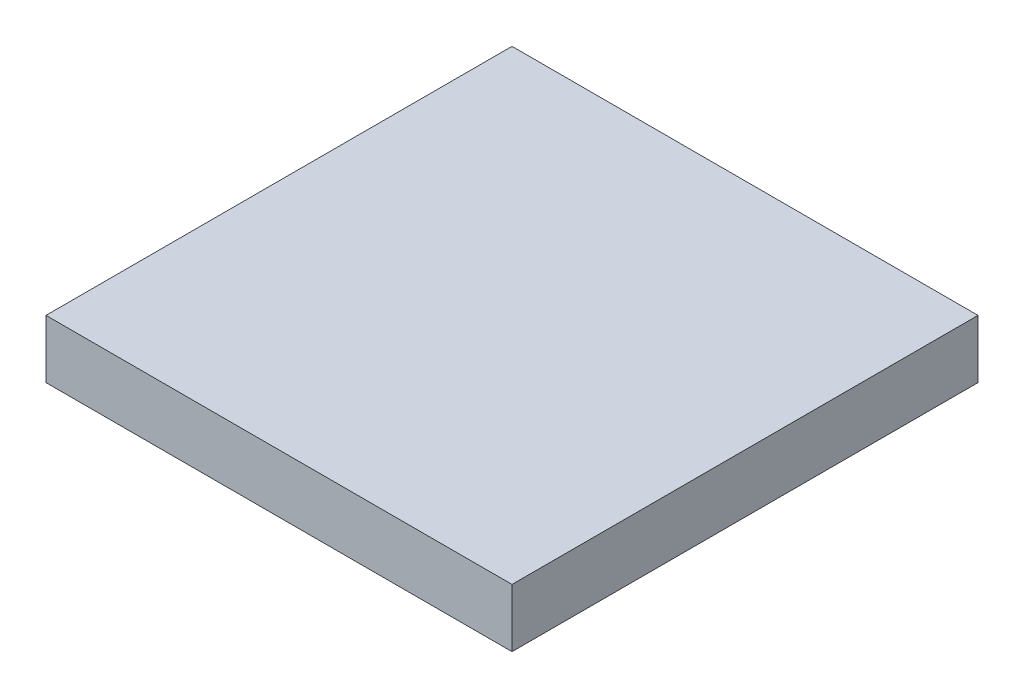
ISO-10303-21;
HEADER;
FILE_DESCRIPTION(('STEP AP214'),'2;1');
FILE_NAME('part.step','',(''),(''),'','','');
FILE_SCHEMA(('AUTOMOTIVE_DESIGN { 1 0 10303 214 1 1 1 1 }'));
ENDSEC;
DATA;
#1=APPLICATION_CONTEXT('core data for automotive mechanical design processes');
#2=APPLICATION_PROTOCOL_DEFINITION('international standard','automotive_design',2000,#1);
#3=PRODUCT_CONTEXT('',#1,'mechanical');
#4=PRODUCT('Part','Part','',(#3));
#5=PRODUCT_RELATED_PRODUCT_CATEGORY('part','',(#4));
#6=PRODUCT_DEFINITION_FORMATION('','',#4);
#7=PRODUCT_DEFINITION_CONTEXT('part definition',#1,'design');
#8=PRODUCT_DEFINITION('design','',#6,#7);
#9=PRODUCT_DEFINITION_SHAPE('','',#8);
#10=(LENGTH_UNIT() NAMED_UNIT(*) SI_UNIT(.MILLI.,.METRE.));
#11=(NAMED_UNIT(*) PLANE_ANGLE_UNIT() SI_UNIT($,.RADIAN.));
#12=(NAMED_UNIT(*) SI_UNIT($,.STERADIAN.) SOLID_ANGLE_UNIT());
#13=UNCERTAINTY_MEASURE_WITH_UNIT(LENGTH_MEASURE(1.E-05),#10,'distance_accuracy_value','');
#14=(GEOMETRIC_REPRESENTATION_CONTEXT(3) GLOBAL_UNCERTAINTY_ASSIGNED_CONTEXT((#13)) GLOBAL_UNIT_ASSIGNED_CONTEXT((#10,
#11,#12)) REPRESENTATION_CONTEXT('',''));
#15=CARTESIAN_POINT('',(0.,0.,0.));
#16=DIRECTION('',(0.,0.,1.));
#17=DIRECTION('',(1.,0.,0.));
#18=AXIS2_PLACEMENT_3D('',#15,#16,#17);
#19=CARTESIAN_POINT('',(60.,7.50000000000006,60.0000000000001));
#20=DIRECTION('',(-1.,0.,0.));
#21=DIRECTION('',(0.,0.,1.));
#22=AXIS2_PLACEMENT_3D('',#19,#20,#21);
#23=PLANE('',#22);
#24=DIRECTION('',(0.,0.,-1.));
#25=VECTOR('',#24,1.);
#26=CARTESIAN_POINT('',(60.,-7.49999999999995,60.0000000000001));
#27=LINE('',#26,#25);
#28=CARTESIAN_POINT('',(60.,-7.49999999999995,60.0000000000001));
#29=VERTEX_POINT('',#28);
#30=CARTESIAN_POINT('',(60.,-7.50000000000006,-60.0000000000001));
#31=VERTEX_POINT('',#30);
#32=EDGE_CURVE('E95',#29,#31,#27,.T.);
#33=ORIENTED_EDGE('',*,*,#32,.T.);
#34=DIRECTION('',(0.,-1.,0.));
#35=VECTOR('',#34,1.);
#36=CARTESIAN_POINT('',(60.,7.49999999999995,-60.0000000000001));
#37=LINE('',#36,#35);
#38=CARTESIAN_POINT('',(60.,7.49999999999995,-60.0000000000001));
#39=VERTEX_POINT('',#38);
#40=EDGE_CURVE('E11',#39,#31,#37,.T.);
#41=ORIENTED_EDGE('',*,*,#40,.F.);
#42=DIRECTION('',(0.,0.,-1.));
#43=VECTOR('',#42,1.);
#44=CARTESIAN_POINT('',(60.,7.50000000000006,60.0000000000001));
#45=LINE('',#44,#43);
#46=CARTESIAN_POINT('',(60.,7.50000000000006,60.0000000000001));
#47=VERTEX_POINT('',#46);
#48=EDGE_CURVE('E83',#47,#39,#45,.T.);
#49=ORIENTED_EDGE('',*,*,#48,.F.);
#50=DIRECTION('',(0.,-1.,0.));
#51=VECTOR('',#50,1.);
#52=CARTESIAN_POINT('',(60.,7.50000000000006,60.0000000000001));
#53=LINE('',#52,#51);
#54=EDGE_CURVE('E91',#47,#29,#53,.T.);
#55=ORIENTED_EDGE('',*,*,#54,.T.);
#56=EDGE_LOOP('',(#33,#41,#49,#55));
#57=FACE_BOUND('',#56,.T.);
#58=ADVANCED_FACE('F32',(#57),#23,.F.);
#59=CARTESIAN_POINT('',(-60.,7.49999999999995,-60.0000000000001));
#60=DIRECTION('',(0.,0.,1.));
#61=DIRECTION('',(1.,0.,0.));
#62=AXIS2_PLACEMENT_3D('',#59,#60,#61);
#63=PLANE('',#62);
#64=DIRECTION('',(-1.,0.,0.));
#65=VECTOR('',#64,1.);
#66=CARTESIAN_POINT('',(-60.,-7.50000000000006,-60.0000000000001));
#67=LINE('',#66,#65);
#68=CARTESIAN_POINT('',(-60.,-7.50000000000006,-60.0000000000001));
#69=VERTEX_POINT('',#68);
#70=EDGE_CURVE('E87',#31,#69,#67,.T.);
#71=ORIENTED_EDGE('',*,*,#70,.T.);
#72=DIRECTION('',(0.,-1.,0.));
#73=VECTOR('',#72,1.);
#74=CARTESIAN_POINT('',(-60.,7.49999999999995,-60.0000000000001));
#75=LINE('',#74,#73);
#76=CARTESIAN_POINT('',(-60.,7.49999999999995,-60.0000000000001));
#77=VERTEX_POINT('',#76);
#78=EDGE_CURVE('E40',#77,#69,#75,.T.);
#79=ORIENTED_EDGE('',*,*,#78,.F.);
#80=DIRECTION('',(-1.,0.,0.));
#81=VECTOR('',#80,1.);
#82=CARTESIAN_POINT('',(-60.,7.49999999999995,-60.0000000000001));
#83=LINE('',#82,#81);
#84=EDGE_CURVE('E78',#39,#77,#83,.T.);
#85=ORIENTED_EDGE('',*,*,#84,.F.);
#86=ORIENTED_EDGE('',*,*,#40,.T.);
#87=EDGE_LOOP('',(#71,#79,#85,#86));
#88=FACE_BOUND('',#87,.T.);
#89=ADVANCED_FACE('F86',(#88),#63,.F.);
#90=CARTESIAN_POINT('',(-60.,7.50000000000006,60.0000000000001));
#91=DIRECTION('',(1.,0.,0.));
#92=DIRECTION('',(0.,0.,-1.));
#93=AXIS2_PLACEMENT_3D('',#90,#91,#92);
#94=PLANE('',#93);
#95=DIRECTION('',(0.,0.,1.));
#96=VECTOR('',#95,1.);
#97=CARTESIAN_POINT('',(-60.,-7.49999999999995,60.0000000000001));
#98=LINE('',#97,#96);
#99=CARTESIAN_POINT('',(-60.,-7.49999999999995,60.0000000000001));
#100=VERTEX_POINT('',#99);
#101=EDGE_CURVE('E65',#69,#100,#98,.T.);
#102=ORIENTED_EDGE('',*,*,#101,.T.);
#103=DIRECTION('',(0.,-1.,0.));
#104=VECTOR('',#103,1.);
#105=CARTESIAN_POINT('',(-60.,7.50000000000006,60.0000000000001));
#106=LINE('',#105,#104);
#107=CARTESIAN_POINT('',(-60.,7.50000000000006,60.0000000000001));
#108=VERTEX_POINT('',#107);
#109=EDGE_CURVE('E88',#108,#100,#106,.T.);
#110=ORIENTED_EDGE('',*,*,#109,.F.);
#111=DIRECTION('',(0.,0.,1.));
#112=VECTOR('',#111,1.);
#113=CARTESIAN_POINT('',(-60.,7.50000000000006,60.0000000000001));
#114=LINE('',#113,#112);
#115=EDGE_CURVE('E81',#77,#108,#114,.T.);
#116=ORIENTED_EDGE('',*,*,#115,.F.);
#117=ORIENTED_EDGE('',*,*,#78,.T.);
#118=EDGE_LOOP('',(#102,#110,#116,#117));
#119=FACE_BOUND('',#118,.T.);
#120=ADVANCED_FACE('F89',(#119),#94,.F.);
#121=CARTESIAN_POINT('',(-60.,7.50000000000006,60.0000000000001));
#122=DIRECTION('',(0.,0.,-1.));
#123=DIRECTION('',(-1.,0.,0.));
#124=AXIS2_PLACEMENT_3D('',#121,#122,#123);
#125=PLANE('',#124);
#126=DIRECTION('',(1.,0.,0.));
#127=VECTOR('',#126,1.);
#128=CARTESIAN_POINT('',(-60.,-7.49999999999995,60.0000000000001));
#129=LINE('',#128,#127);
#130=EDGE_CURVE('E71',#100,#29,#129,.T.);
#131=ORIENTED_EDGE('',*,*,#130,.T.);
#132=ORIENTED_EDGE('',*,*,#54,.F.);
#133=DIRECTION('',(1.,0.,0.));
#134=VECTOR('',#133,1.);
#135=CARTESIAN_POINT('',(-60.,7.50000000000006,60.0000000000001));
#136=LINE('',#135,#134);
#137=EDGE_CURVE('E48',#108,#47,#136,.T.);
#138=ORIENTED_EDGE('',*,*,#137,.F.);
#139=ORIENTED_EDGE('',*,*,#109,.T.);
#140=EDGE_LOOP('',(#131,#132,#138,#139));
#141=FACE_BOUND('',#140,.T.);
#142=ADVANCED_FACE('F102',(#141),#125,.F.);
#143=CARTESIAN_POINT('',(0.,7.49999999999995,0.));
#144=DIRECTION('',(0.,-1.,0.));
#145=DIRECTION('',(0.,0.,-1.));
#146=AXIS2_PLACEMENT_3D('',#143,#144,#145);
#147=PLANE('',#146);
#148=ORIENTED_EDGE('',*,*,#48,.T.);
#149=ORIENTED_EDGE('',*,*,#84,.T.);
#150=ORIENTED_EDGE('',*,*,#115,.T.);
#151=ORIENTED_EDGE('',*,*,#137,.T.);
#152=EDGE_LOOP('',(#148,#149,#150,#151));
#153=FACE_BOUND('',#152,.T.);
#154=ADVANCED_FACE('F79',(#153),#147,.F.);
#155=CARTESIAN_POINT('',(0.,-7.49999999999995,0.));
#156=DIRECTION('',(0.,-1.,0.));
#157=DIRECTION('',(0.,0.,-1.));
#158=AXIS2_PLACEMENT_3D('',#155,#156,#157);
#159=PLANE('',#158);
#160=ORIENTED_EDGE('',*,*,#32,.F.);
#161=ORIENTED_EDGE('',*,*,#130,.F.);
#162=ORIENTED_EDGE('',*,*,#101,.F.);
#163=ORIENTED_EDGE('',*,*,#70,.F.);
#164=EDGE_LOOP('',(#160,#161,#162,#163));
#165=FACE_BOUND('',#164,.T.);
#166=ADVANCED_FACE('F105',(#165),#159,.T.);
#167=CLOSED_SHELL('',(#58,#89,#120,#142,#154,#166));
#168=MANIFOLD_SOLID_BREP('B2',#167);
#169=ADVANCED_BREP_SHAPE_REPRESENTATION('',(#18,#168),#14);
#170=SHAPE_DEFINITION_REPRESENTATION(#9,#169);
ENDSEC;
END-ISO-10303-21;
